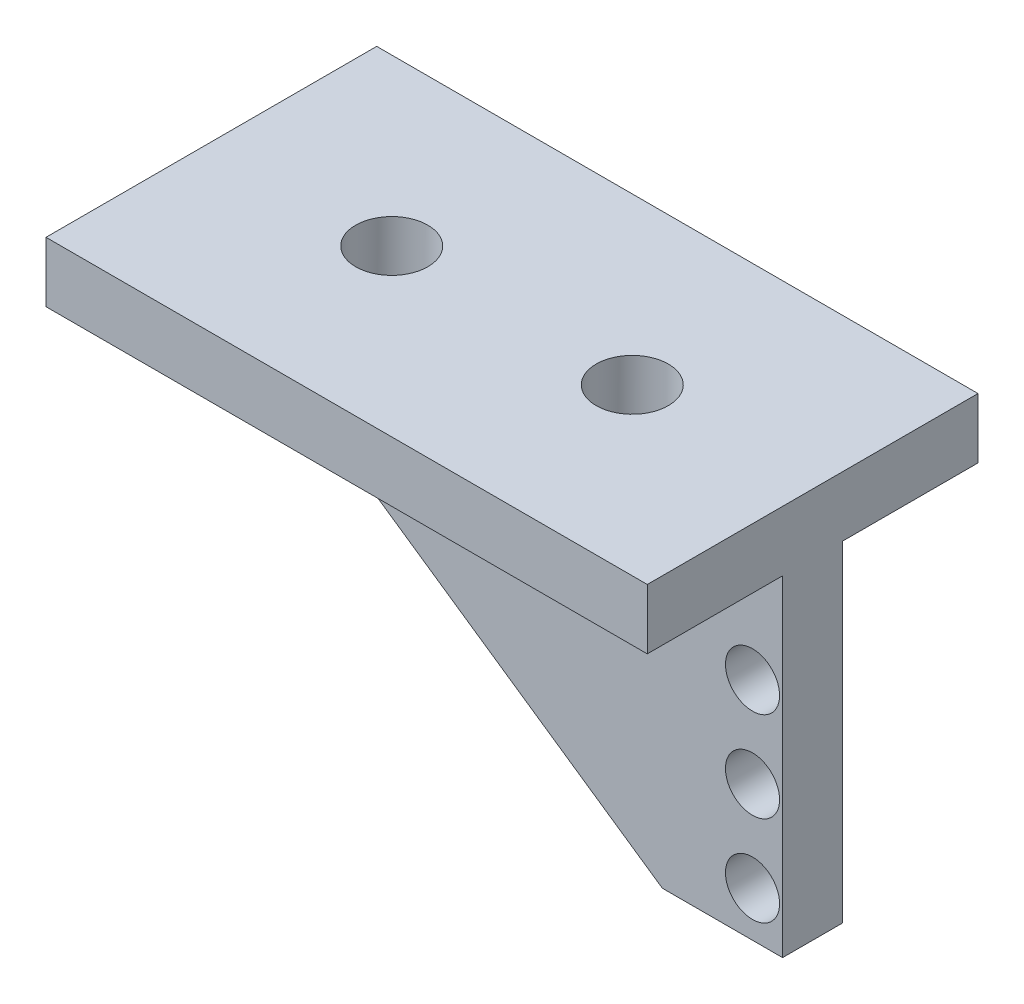
ISO-10303-21;
HEADER;
FILE_DESCRIPTION(('STEP AP214'),'2;1');
FILE_NAME('part.step','',(''),(''),'','','');
FILE_SCHEMA(('AUTOMOTIVE_DESIGN { 1 0 10303 214 1 1 1 1 }'));
ENDSEC;
DATA;
#1=APPLICATION_CONTEXT('core data for automotive mechanical design processes');
#2=APPLICATION_PROTOCOL_DEFINITION('international standard','automotive_design',2000,#1);
#3=PRODUCT_CONTEXT('',#1,'mechanical');
#4=PRODUCT('Part','Part','',(#3));
#5=PRODUCT_RELATED_PRODUCT_CATEGORY('part','',(#4));
#6=PRODUCT_DEFINITION_FORMATION('','',#4);
#7=PRODUCT_DEFINITION_CONTEXT('part definition',#1,'design');
#8=PRODUCT_DEFINITION('design','',#6,#7);
#9=PRODUCT_DEFINITION_SHAPE('','',#8);
#10=(LENGTH_UNIT() NAMED_UNIT(*) SI_UNIT(.MILLI.,.METRE.));
#11=(NAMED_UNIT(*) PLANE_ANGLE_UNIT() SI_UNIT($,.RADIAN.));
#12=(NAMED_UNIT(*) SI_UNIT($,.STERADIAN.) SOLID_ANGLE_UNIT());
#13=UNCERTAINTY_MEASURE_WITH_UNIT(LENGTH_MEASURE(1.E-05),#10,'distance_accuracy_value','');
#14=(GEOMETRIC_REPRESENTATION_CONTEXT(3) GLOBAL_UNCERTAINTY_ASSIGNED_CONTEXT((#13)) GLOBAL_UNIT_ASSIGNED_CONTEXT((#10,
#11,#12)) REPRESENTATION_CONTEXT('',''));
#15=CARTESIAN_POINT('',(0.,0.,0.));
#16=DIRECTION('',(0.,0.,1.));
#17=DIRECTION('',(1.,0.,0.));
#18=AXIS2_PLACEMENT_3D('',#15,#16,#17);
#19=CARTESIAN_POINT('',(0.,-2.,0.));
#20=DIRECTION('',(0.,-1.,0.));
#21=DIRECTION('',(0.,0.,-1.));
#22=AXIS2_PLACEMENT_3D('',#19,#20,#21);
#23=PLANE('',#22);
#24=CARTESIAN_POINT('',(-6.,-2.,0.));
#25=DIRECTION('',(0.,1.,0.));
#26=DIRECTION('',(0.,0.,1.));
#27=AXIS2_PLACEMENT_3D('',#24,#25,#26);
#28=CIRCLE('',#27,1.2);
#29=CARTESIAN_POINT('',(-6.66332495807108,-2.,1.));
#30=VERTEX_POINT('',#29);
#31=CARTESIAN_POINT('',(-5.33667504192892,-2.,1.));
#32=VERTEX_POINT('',#31);
#33=EDGE_CURVE('E271',#30,#32,#28,.T.);
#34=ORIENTED_EDGE('',*,*,#33,.T.);
#35=DIRECTION('',(1.,0.,0.));
#36=VECTOR('',#35,1.);
#37=CARTESIAN_POINT('',(0.,-2.,1.));
#38=LINE('',#37,#36);
#39=CARTESIAN_POINT('',(0.,-2.,1.));
#40=VERTEX_POINT('',#39);
#41=EDGE_CURVE('E157',#32,#40,#38,.T.);
#42=ORIENTED_EDGE('',*,*,#41,.T.);
#43=DIRECTION('',(0.,0.,-1.));
#44=VECTOR('',#43,1.);
#45=CARTESIAN_POINT('',(0.,-2.,-5.5));
#46=LINE('',#45,#44);
#47=CARTESIAN_POINT('',(0.,-2.,5.5));
#48=VERTEX_POINT('',#47);
#49=EDGE_CURVE('E172',#48,#40,#46,.T.);
#50=ORIENTED_EDGE('',*,*,#49,.F.);
#51=DIRECTION('',(1.,0.,0.));
#52=VECTOR('',#51,1.);
#53=CARTESIAN_POINT('',(0.,-2.,5.5));
#54=LINE('',#53,#52);
#55=CARTESIAN_POINT('',(-20.,-2.,5.5));
#56=VERTEX_POINT('',#55);
#57=EDGE_CURVE('E167',#56,#48,#54,.T.);
#58=ORIENTED_EDGE('',*,*,#57,.F.);
#59=DIRECTION('',(0.,0.,1.));
#60=VECTOR('',#59,1.);
#61=CARTESIAN_POINT('',(-20.,-2.,5.5));
#62=LINE('',#61,#60);
#63=CARTESIAN_POINT('',(-20.,-2.,1.));
#64=VERTEX_POINT('',#63);
#65=EDGE_CURVE('E168',#64,#56,#62,.T.);
#66=ORIENTED_EDGE('',*,*,#65,.F.);
#67=CARTESIAN_POINT('',(-14.6633249580711,-2.,1.));
#68=VERTEX_POINT('',#67);
#69=EDGE_CURVE('E153',#64,#68,#38,.T.);
#70=ORIENTED_EDGE('',*,*,#69,.T.);
#71=CARTESIAN_POINT('',(-14.,-2.,0.));
#72=DIRECTION('',(0.,1.,0.));
#73=DIRECTION('',(0.,0.,1.));
#74=AXIS2_PLACEMENT_3D('',#71,#72,#73);
#75=CIRCLE('',#74,1.2);
#76=CARTESIAN_POINT('',(-13.3366750419289,-2.,1.));
#77=VERTEX_POINT('',#76);
#78=EDGE_CURVE('E143',#68,#77,#75,.T.);
#79=ORIENTED_EDGE('',*,*,#78,.T.);
#80=EDGE_CURVE('E152',#77,#30,#38,.T.);
#81=ORIENTED_EDGE('',*,*,#80,.T.);
#82=EDGE_LOOP('',(#34,#42,#50,#58,#66,#70,#79,#81));
#83=FACE_BOUND('',#82,.T.);
#84=ADVANCED_FACE('F39',(#83),#23,.T.);
#85=CARTESIAN_POINT('',(-20.,-2.,5.5));
#86=DIRECTION('',(-1.,0.,0.));
#87=DIRECTION('',(0.,0.,1.));
#88=AXIS2_PLACEMENT_3D('',#85,#86,#87);
#89=PLANE('',#88);
#90=CARTESIAN_POINT('',(-20.,-2.,-5.5));
#91=VERTEX_POINT('',#90);
#92=CARTESIAN_POINT('',(-20.,-2.,-1.));
#93=VERTEX_POINT('',#92);
#94=EDGE_CURVE('E164',#91,#93,#62,.T.);
#95=ORIENTED_EDGE('',*,*,#94,.T.);
#96=DIRECTION('',(0.,0.,-1.));
#97=VECTOR('',#96,1.);
#98=CARTESIAN_POINT('',(-20.,-2.,1.));
#99=LINE('',#98,#97);
#100=EDGE_CURVE('E220',#64,#93,#99,.T.);
#101=ORIENTED_EDGE('',*,*,#100,.F.);
#102=ORIENTED_EDGE('',*,*,#65,.T.);
#103=DIRECTION('',(0.,1.,0.));
#104=VECTOR('',#103,1.);
#105=CARTESIAN_POINT('',(-20.,-2.,5.5));
#106=LINE('',#105,#104);
#107=CARTESIAN_POINT('',(-20.,0.,5.5));
#108=VERTEX_POINT('',#107);
#109=EDGE_CURVE('E43',#56,#108,#106,.T.);
#110=ORIENTED_EDGE('',*,*,#109,.T.);
#111=DIRECTION('',(0.,0.,1.));
#112=VECTOR('',#111,1.);
#113=CARTESIAN_POINT('',(-20.,0.,5.5));
#114=LINE('',#113,#112);
#115=CARTESIAN_POINT('',(-20.,0.,-5.5));
#116=VERTEX_POINT('',#115);
#117=EDGE_CURVE('E159',#116,#108,#114,.T.);
#118=ORIENTED_EDGE('',*,*,#117,.F.);
#119=DIRECTION('',(0.,1.,0.));
#120=VECTOR('',#119,1.);
#121=CARTESIAN_POINT('',(-20.,-2.,-5.5));
#122=LINE('',#121,#120);
#123=EDGE_CURVE('E11',#91,#116,#122,.T.);
#124=ORIENTED_EDGE('',*,*,#123,.F.);
#125=EDGE_LOOP('',(#95,#101,#102,#110,#118,#124));
#126=FACE_BOUND('',#125,.T.);
#127=ADVANCED_FACE('F41',(#126),#89,.T.);
#128=CARTESIAN_POINT('',(-20.,-2.,-5.5));
#129=DIRECTION('',(0.,0.,-1.));
#130=DIRECTION('',(-1.,0.,0.));
#131=AXIS2_PLACEMENT_3D('',#128,#129,#130);
#132=PLANE('',#131);
#133=DIRECTION('',(-1.,0.,0.));
#134=VECTOR('',#133,1.);
#135=CARTESIAN_POINT('',(-20.,0.,-5.5));
#136=LINE('',#135,#134);
#137=CARTESIAN_POINT('',(0.,0.,-5.5));
#138=VERTEX_POINT('',#137);
#139=EDGE_CURVE('E184',#138,#116,#136,.T.);
#140=ORIENTED_EDGE('',*,*,#139,.F.);
#141=DIRECTION('',(0.,1.,0.));
#142=VECTOR('',#141,1.);
#143=CARTESIAN_POINT('',(0.,-2.,-5.5));
#144=LINE('',#143,#142);
#145=CARTESIAN_POINT('',(0.,-2.,-5.5));
#146=VERTEX_POINT('',#145);
#147=EDGE_CURVE('E48',#146,#138,#144,.T.);
#148=ORIENTED_EDGE('',*,*,#147,.F.);
#149=DIRECTION('',(-1.,0.,0.));
#150=VECTOR('',#149,1.);
#151=CARTESIAN_POINT('',(-20.,-2.,-5.5));
#152=LINE('',#151,#150);
#153=EDGE_CURVE('E175',#146,#91,#152,.T.);
#154=ORIENTED_EDGE('',*,*,#153,.T.);
#155=ORIENTED_EDGE('',*,*,#123,.T.);
#156=EDGE_LOOP('',(#140,#148,#154,#155));
#157=FACE_BOUND('',#156,.T.);
#158=ADVANCED_FACE('F204',(#157),#132,.T.);
#159=CARTESIAN_POINT('',(0.,-2.,-5.5));
#160=DIRECTION('',(1.,0.,0.));
#161=DIRECTION('',(0.,0.,-1.));
#162=AXIS2_PLACEMENT_3D('',#159,#160,#161);
#163=PLANE('',#162);
#164=ORIENTED_EDGE('',*,*,#147,.T.);
#165=DIRECTION('',(0.,0.,-1.));
#166=VECTOR('',#165,1.);
#167=CARTESIAN_POINT('',(0.,0.,-5.5));
#168=LINE('',#167,#166);
#169=CARTESIAN_POINT('',(0.,0.,5.5));
#170=VERTEX_POINT('',#169);
#171=EDGE_CURVE('E182',#170,#138,#168,.T.);
#172=ORIENTED_EDGE('',*,*,#171,.F.);
#173=DIRECTION('',(0.,1.,0.));
#174=VECTOR('',#173,1.);
#175=CARTESIAN_POINT('',(0.,-2.,5.5));
#176=LINE('',#175,#174);
#177=EDGE_CURVE('E188',#48,#170,#176,.T.);
#178=ORIENTED_EDGE('',*,*,#177,.F.);
#179=ORIENTED_EDGE('',*,*,#49,.T.);
#180=DIRECTION('',(0.,1.,0.));
#181=VECTOR('',#180,1.);
#182=CARTESIAN_POINT('',(0.,0.,1.));
#183=LINE('',#182,#181);
#184=CARTESIAN_POINT('',(0.,-13.,1.));
#185=VERTEX_POINT('',#184);
#186=EDGE_CURVE('E233',#185,#40,#183,.T.);
#187=ORIENTED_EDGE('',*,*,#186,.F.);
#188=DIRECTION('',(0.,0.,-1.));
#189=VECTOR('',#188,1.);
#190=CARTESIAN_POINT('',(0.,-13.,1.));
#191=LINE('',#190,#189);
#192=CARTESIAN_POINT('',(0.,-13.,-1.));
#193=VERTEX_POINT('',#192);
#194=EDGE_CURVE('E228',#185,#193,#191,.T.);
#195=ORIENTED_EDGE('',*,*,#194,.T.);
#196=DIRECTION('',(0.,1.,0.));
#197=VECTOR('',#196,1.);
#198=CARTESIAN_POINT('',(0.,0.,-1.));
#199=LINE('',#198,#197);
#200=CARTESIAN_POINT('',(0.,-2.,-1.));
#201=VERTEX_POINT('',#200);
#202=EDGE_CURVE('E234',#193,#201,#199,.T.);
#203=ORIENTED_EDGE('',*,*,#202,.T.);
#204=EDGE_CURVE('E171',#201,#146,#46,.T.);
#205=ORIENTED_EDGE('',*,*,#204,.T.);
#206=EDGE_LOOP('',(#164,#172,#178,#179,#187,#195,#203,#205));
#207=FACE_BOUND('',#206,.T.);
#208=ADVANCED_FACE('F281',(#207),#163,.T.);
#209=CARTESIAN_POINT('',(0.,-2.,5.5));
#210=DIRECTION('',(0.,0.,1.));
#211=DIRECTION('',(1.,0.,0.));
#212=AXIS2_PLACEMENT_3D('',#209,#210,#211);
#213=PLANE('',#212);
#214=DIRECTION('',(1.,0.,0.));
#215=VECTOR('',#214,1.);
#216=CARTESIAN_POINT('',(0.,0.,5.5));
#217=LINE('',#216,#215);
#218=EDGE_CURVE('E179',#108,#170,#217,.T.);
#219=ORIENTED_EDGE('',*,*,#218,.F.);
#220=ORIENTED_EDGE('',*,*,#109,.F.);
#221=ORIENTED_EDGE('',*,*,#57,.T.);
#222=ORIENTED_EDGE('',*,*,#177,.T.);
#223=EDGE_LOOP('',(#219,#220,#221,#222));
#224=FACE_BOUND('',#223,.T.);
#225=ADVANCED_FACE('F198',(#224),#213,.T.);
#226=CARTESIAN_POINT('',(-5.33667504192892,-2.,-1.));
#227=VERTEX_POINT('',#226);
#228=CARTESIAN_POINT('',(-6.66332495807108,-2.,-1.));
#229=VERTEX_POINT('',#228);
#230=EDGE_CURVE('E272',#227,#229,#28,.T.);
#231=ORIENTED_EDGE('',*,*,#230,.T.);
#232=DIRECTION('',(1.,0.,0.));
#233=VECTOR('',#232,1.);
#234=CARTESIAN_POINT('',(0.,-2.,-1.));
#235=LINE('',#234,#233);
#236=CARTESIAN_POINT('',(-13.3366750419289,-2.,-1.));
#237=VERTEX_POINT('',#236);
#238=EDGE_CURVE('E218',#237,#229,#235,.T.);
#239=ORIENTED_EDGE('',*,*,#238,.F.);
#240=CARTESIAN_POINT('',(-14.6633249580711,-2.,-1.));
#241=VERTEX_POINT('',#240);
#242=EDGE_CURVE('E145',#237,#241,#75,.T.);
#243=ORIENTED_EDGE('',*,*,#242,.T.);
#244=EDGE_CURVE('E160',#93,#241,#235,.T.);
#245=ORIENTED_EDGE('',*,*,#244,.F.);
#246=ORIENTED_EDGE('',*,*,#94,.F.);
#247=ORIENTED_EDGE('',*,*,#153,.F.);
#248=ORIENTED_EDGE('',*,*,#204,.F.);
#249=EDGE_CURVE('E217',#227,#201,#235,.T.);
#250=ORIENTED_EDGE('',*,*,#249,.F.);
#251=EDGE_LOOP('',(#231,#239,#243,#245,#246,#247,#248,#250));
#252=FACE_BOUND('',#251,.T.);
#253=ADVANCED_FACE('F210',(#252),#23,.T.);
#254=CARTESIAN_POINT('',(0.,0.,0.));
#255=DIRECTION('',(0.,-1.,0.));
#256=DIRECTION('',(0.,0.,-1.));
#257=AXIS2_PLACEMENT_3D('',#254,#255,#256);
#258=PLANE('',#257);
#259=CARTESIAN_POINT('',(-6.,0.,0.));
#260=DIRECTION('',(0.,1.,0.));
#261=DIRECTION('',(0.,0.,1.));
#262=AXIS2_PLACEMENT_3D('',#259,#260,#261);
#263=CIRCLE('',#262,1.2);
#264=CARTESIAN_POINT('',(-6.,0.,1.2));
#265=VERTEX_POINT('',#264);
#266=EDGE_CURVE('E268',#265,#265,#263,.T.);
#267=ORIENTED_EDGE('',*,*,#266,.F.);
#268=EDGE_LOOP('',(#267));
#269=FACE_BOUND('',#268,.T.);
#270=CARTESIAN_POINT('',(-14.,0.,0.));
#271=DIRECTION('',(0.,1.,0.));
#272=DIRECTION('',(0.,0.,1.));
#273=AXIS2_PLACEMENT_3D('',#270,#271,#272);
#274=CIRCLE('',#273,1.2);
#275=CARTESIAN_POINT('',(-14.,0.,1.2));
#276=VERTEX_POINT('',#275);
#277=EDGE_CURVE('E147',#276,#276,#274,.T.);
#278=ORIENTED_EDGE('',*,*,#277,.F.);
#279=EDGE_LOOP('',(#278));
#280=FACE_BOUND('',#279,.T.);
#281=ORIENTED_EDGE('',*,*,#117,.T.);
#282=ORIENTED_EDGE('',*,*,#218,.T.);
#283=ORIENTED_EDGE('',*,*,#171,.T.);
#284=ORIENTED_EDGE('',*,*,#139,.T.);
#285=EDGE_LOOP('',(#281,#282,#283,#284));
#286=FACE_BOUND('',#285,.T.);
#287=ADVANCED_FACE('F200',(#269,#280,#286),#258,.F.);
#288=CARTESIAN_POINT('',(-4.,-13.,1.));
#289=DIRECTION('',(0.566528822887065,0.824041924199368,0.));
#290=DIRECTION('',(-0.824041924199368,0.566528822887065,0.));
#291=AXIS2_PLACEMENT_3D('',#288,#289,#290);
#292=PLANE('',#291);
#293=DIRECTION('',(0.824041924199368,-0.566528822887065,0.));
#294=VECTOR('',#293,1.);
#295=CARTESIAN_POINT('',(-4.,-13.,-1.));
#296=LINE('',#295,#294);
#297=CARTESIAN_POINT('',(-4.,-13.,-1.));
#298=VERTEX_POINT('',#297);
#299=EDGE_CURVE('E240',#93,#298,#296,.T.);
#300=ORIENTED_EDGE('',*,*,#299,.T.);
#301=DIRECTION('',(0.,0.,-1.));
#302=VECTOR('',#301,1.);
#303=CARTESIAN_POINT('',(-4.,-13.,1.));
#304=LINE('',#303,#302);
#305=CARTESIAN_POINT('',(-4.,-13.,1.));
#306=VERTEX_POINT('',#305);
#307=EDGE_CURVE('E224',#306,#298,#304,.T.);
#308=ORIENTED_EDGE('',*,*,#307,.F.);
#309=DIRECTION('',(0.824041924199368,-0.566528822887065,0.));
#310=VECTOR('',#309,1.);
#311=CARTESIAN_POINT('',(-4.,-13.,1.));
#312=LINE('',#311,#310);
#313=EDGE_CURVE('E237',#64,#306,#312,.T.);
#314=ORIENTED_EDGE('',*,*,#313,.F.);
#315=ORIENTED_EDGE('',*,*,#100,.T.);
#316=EDGE_LOOP('',(#300,#308,#314,#315));
#317=FACE_BOUND('',#316,.T.);
#318=ADVANCED_FACE('F283',(#317),#292,.F.);
#319=CARTESIAN_POINT('',(0.,-13.,1.));
#320=DIRECTION('',(0.,1.,0.));
#321=DIRECTION('',(0.,0.,1.));
#322=AXIS2_PLACEMENT_3D('',#319,#320,#321);
#323=PLANE('',#322);
#324=DIRECTION('',(1.,0.,0.));
#325=VECTOR('',#324,1.);
#326=CARTESIAN_POINT('',(0.,-13.,-1.));
#327=LINE('',#326,#325);
#328=EDGE_CURVE('E238',#298,#193,#327,.T.);
#329=ORIENTED_EDGE('',*,*,#328,.T.);
#330=ORIENTED_EDGE('',*,*,#194,.F.);
#331=DIRECTION('',(1.,0.,0.));
#332=VECTOR('',#331,1.);
#333=CARTESIAN_POINT('',(0.,-13.,1.));
#334=LINE('',#333,#332);
#335=EDGE_CURVE('E245',#306,#185,#334,.T.);
#336=ORIENTED_EDGE('',*,*,#335,.F.);
#337=ORIENTED_EDGE('',*,*,#307,.T.);
#338=EDGE_LOOP('',(#329,#330,#336,#337));
#339=FACE_BOUND('',#338,.T.);
#340=ADVANCED_FACE('F286',(#339),#323,.F.);
#341=CARTESIAN_POINT('',(0.,0.,1.));
#342=DIRECTION('',(0.,0.,-1.));
#343=DIRECTION('',(-1.,0.,0.));
#344=AXIS2_PLACEMENT_3D('',#341,#342,#343);
#345=PLANE('',#344);
#346=CARTESIAN_POINT('',(-1.,-5.5,1.));
#347=DIRECTION('',(0.,0.,1.));
#348=DIRECTION('',(1.,0.,0.));
#349=AXIS2_PLACEMENT_3D('',#346,#347,#348);
#350=CIRCLE('',#349,0.9);
#351=CARTESIAN_POINT('',(-0.1,-5.5,1.));
#352=VERTEX_POINT('',#351);
#353=EDGE_CURVE('E242',#352,#352,#350,.T.);
#354=ORIENTED_EDGE('',*,*,#353,.F.);
#355=EDGE_LOOP('',(#354));
#356=FACE_BOUND('',#355,.T.);
#357=CARTESIAN_POINT('',(-1.,-8.5,1.));
#358=DIRECTION('',(0.,0.,1.));
#359=DIRECTION('',(1.,0.,0.));
#360=AXIS2_PLACEMENT_3D('',#357,#358,#359);
#361=CIRCLE('',#360,0.9);
#362=CARTESIAN_POINT('',(-0.1,-8.5,1.));
#363=VERTEX_POINT('',#362);
#364=EDGE_CURVE('E254',#363,#363,#361,.T.);
#365=ORIENTED_EDGE('',*,*,#364,.F.);
#366=EDGE_LOOP('',(#365));
#367=FACE_BOUND('',#366,.T.);
#368=CARTESIAN_POINT('',(-1.,-11.5,1.));
#369=DIRECTION('',(0.,0.,1.));
#370=DIRECTION('',(1.,0.,0.));
#371=AXIS2_PLACEMENT_3D('',#368,#369,#370);
#372=CIRCLE('',#371,0.9);
#373=CARTESIAN_POINT('',(-0.1,-11.5,1.));
#374=VERTEX_POINT('',#373);
#375=EDGE_CURVE('E248',#374,#374,#372,.T.);
#376=ORIENTED_EDGE('',*,*,#375,.F.);
#377=EDGE_LOOP('',(#376));
#378=FACE_BOUND('',#377,.T.);
#379=ORIENTED_EDGE('',*,*,#69,.F.);
#380=ORIENTED_EDGE('',*,*,#313,.T.);
#381=ORIENTED_EDGE('',*,*,#335,.T.);
#382=ORIENTED_EDGE('',*,*,#186,.T.);
#383=ORIENTED_EDGE('',*,*,#41,.F.);
#384=DIRECTION('',(1.,0.,0.));
#385=VECTOR('',#384,1.);
#386=CARTESIAN_POINT('',(0.,-2.,1.));
#387=LINE('',#386,#385);
#388=EDGE_CURVE('E136',#30,#32,#387,.T.);
#389=ORIENTED_EDGE('',*,*,#388,.F.);
#390=ORIENTED_EDGE('',*,*,#80,.F.);
#391=DIRECTION('',(1.,0.,0.));
#392=VECTOR('',#391,1.);
#393=CARTESIAN_POINT('',(0.,-2.,1.));
#394=LINE('',#393,#392);
#395=EDGE_CURVE('E127',#68,#77,#394,.T.);
#396=ORIENTED_EDGE('',*,*,#395,.F.);
#397=EDGE_LOOP('',(#379,#380,#381,#382,#383,#389,#390,#396));
#398=FACE_BOUND('',#397,.T.);
#399=ADVANCED_FACE('F155',(#356,#367,#378,#398),#345,.F.);
#400=CARTESIAN_POINT('',(0.,0.,-1.));
#401=DIRECTION('',(0.,0.,-1.));
#402=DIRECTION('',(-1.,0.,0.));
#403=AXIS2_PLACEMENT_3D('',#400,#401,#402);
#404=PLANE('',#403);
#405=CARTESIAN_POINT('',(-1.,-5.5,-1.));
#406=DIRECTION('',(0.,0.,1.));
#407=DIRECTION('',(1.,0.,0.));
#408=AXIS2_PLACEMENT_3D('',#405,#406,#407);
#409=CIRCLE('',#408,0.9);
#410=CARTESIAN_POINT('',(-0.1,-5.5,-1.));
#411=VERTEX_POINT('',#410);
#412=EDGE_CURVE('E260',#411,#411,#409,.T.);
#413=ORIENTED_EDGE('',*,*,#412,.T.);
#414=EDGE_LOOP('',(#413));
#415=FACE_BOUND('',#414,.T.);
#416=CARTESIAN_POINT('',(-1.,-8.5,-1.));
#417=DIRECTION('',(0.,0.,1.));
#418=DIRECTION('',(1.,0.,0.));
#419=AXIS2_PLACEMENT_3D('',#416,#417,#418);
#420=CIRCLE('',#419,0.9);
#421=CARTESIAN_POINT('',(-0.1,-8.5,-1.));
#422=VERTEX_POINT('',#421);
#423=EDGE_CURVE('E257',#422,#422,#420,.T.);
#424=ORIENTED_EDGE('',*,*,#423,.T.);
#425=EDGE_LOOP('',(#424));
#426=FACE_BOUND('',#425,.T.);
#427=CARTESIAN_POINT('',(-1.,-11.5,-1.));
#428=DIRECTION('',(0.,0.,1.));
#429=DIRECTION('',(1.,0.,0.));
#430=AXIS2_PLACEMENT_3D('',#427,#428,#429);
#431=CIRCLE('',#430,0.9);
#432=CARTESIAN_POINT('',(-0.1,-11.5,-1.));
#433=VERTEX_POINT('',#432);
#434=EDGE_CURVE('E251',#433,#433,#431,.T.);
#435=ORIENTED_EDGE('',*,*,#434,.T.);
#436=EDGE_LOOP('',(#435));
#437=FACE_BOUND('',#436,.T.);
#438=ORIENTED_EDGE('',*,*,#299,.F.);
#439=ORIENTED_EDGE('',*,*,#244,.T.);
#440=EDGE_CURVE('E216',#241,#237,#235,.T.);
#441=ORIENTED_EDGE('',*,*,#440,.T.);
#442=ORIENTED_EDGE('',*,*,#238,.T.);
#443=EDGE_CURVE('E219',#229,#227,#235,.T.);
#444=ORIENTED_EDGE('',*,*,#443,.T.);
#445=ORIENTED_EDGE('',*,*,#249,.T.);
#446=ORIENTED_EDGE('',*,*,#202,.F.);
#447=ORIENTED_EDGE('',*,*,#328,.F.);
#448=EDGE_LOOP('',(#438,#439,#441,#442,#444,#445,#446,#447));
#449=FACE_BOUND('',#448,.T.);
#450=ADVANCED_FACE('F287',(#415,#426,#437,#449),#404,.T.);
#451=CARTESIAN_POINT('',(-1.,-11.5,1.));
#452=DIRECTION('',(0.,0.,-1.));
#453=DIRECTION('',(-1.,0.,0.));
#454=AXIS2_PLACEMENT_3D('',#451,#452,#453);
#455=CYLINDRICAL_SURFACE('',#454,0.9);
#456=ORIENTED_EDGE('',*,*,#375,.T.);
#457=EDGE_LOOP('',(#456));
#458=FACE_BOUND('',#457,.T.);
#459=ORIENTED_EDGE('',*,*,#434,.F.);
#460=EDGE_LOOP('',(#459));
#461=FACE_BOUND('',#460,.T.);
#462=ADVANCED_FACE('F388',(#458,#461),#455,.F.);
#463=CARTESIAN_POINT('',(-1.,-8.5,1.));
#464=DIRECTION('',(0.,0.,-1.));
#465=DIRECTION('',(-1.,0.,0.));
#466=AXIS2_PLACEMENT_3D('',#463,#464,#465);
#467=CYLINDRICAL_SURFACE('',#466,0.9);
#468=ORIENTED_EDGE('',*,*,#364,.T.);
#469=EDGE_LOOP('',(#468));
#470=FACE_BOUND('',#469,.T.);
#471=ORIENTED_EDGE('',*,*,#423,.F.);
#472=EDGE_LOOP('',(#471));
#473=FACE_BOUND('',#472,.T.);
#474=ADVANCED_FACE('F397',(#470,#473),#467,.F.);
#475=CARTESIAN_POINT('',(-1.,-5.5,1.));
#476=DIRECTION('',(0.,0.,-1.));
#477=DIRECTION('',(-1.,0.,0.));
#478=AXIS2_PLACEMENT_3D('',#475,#476,#477);
#479=CYLINDRICAL_SURFACE('',#478,0.9);
#480=ORIENTED_EDGE('',*,*,#353,.T.);
#481=EDGE_LOOP('',(#480));
#482=FACE_BOUND('',#481,.T.);
#483=ORIENTED_EDGE('',*,*,#412,.F.);
#484=EDGE_LOOP('',(#483));
#485=FACE_BOUND('',#484,.T.);
#486=ADVANCED_FACE('F307',(#482,#485),#479,.F.);
#487=CARTESIAN_POINT('',(-14.,-2.,0.));
#488=DIRECTION('',(0.,1.,0.));
#489=DIRECTION('',(0.,0.,1.));
#490=AXIS2_PLACEMENT_3D('',#487,#488,#489);
#491=PLANE('',#490);
#492=ORIENTED_EDGE('',*,*,#395,.T.);
#493=EDGE_CURVE('E130',#77,#237,#75,.T.);
#494=ORIENTED_EDGE('',*,*,#493,.T.);
#495=ORIENTED_EDGE('',*,*,#440,.F.);
#496=EDGE_CURVE('E64',#241,#68,#75,.T.);
#497=ORIENTED_EDGE('',*,*,#496,.T.);
#498=EDGE_LOOP('',(#492,#494,#495,#497));
#499=FACE_BOUND('',#498,.T.);
#500=ADVANCED_FACE('F129',(#499),#491,.T.);
#501=CARTESIAN_POINT('',(-14.,-2.,0.));
#502=DIRECTION('',(0.,1.,0.));
#503=DIRECTION('',(0.,0.,1.));
#504=AXIS2_PLACEMENT_3D('',#501,#502,#503);
#505=CYLINDRICAL_SURFACE('',#504,1.2);
#506=ORIENTED_EDGE('',*,*,#493,.F.);
#507=ORIENTED_EDGE('',*,*,#78,.F.);
#508=ORIENTED_EDGE('',*,*,#496,.F.);
#509=ORIENTED_EDGE('',*,*,#242,.F.);
#510=EDGE_LOOP('',(#506,#507,#508,#509));
#511=FACE_BOUND('',#510,.T.);
#512=ORIENTED_EDGE('',*,*,#277,.T.);
#513=EDGE_LOOP('',(#512));
#514=FACE_BOUND('',#513,.T.);
#515=ADVANCED_FACE('F141',(#511,#514),#505,.F.);
#516=CARTESIAN_POINT('',(-6.,-2.,0.));
#517=DIRECTION('',(0.,1.,0.));
#518=DIRECTION('',(0.,0.,1.));
#519=AXIS2_PLACEMENT_3D('',#516,#517,#518);
#520=PLANE('',#519);
#521=ORIENTED_EDGE('',*,*,#388,.T.);
#522=EDGE_CURVE('E137',#32,#227,#28,.T.);
#523=ORIENTED_EDGE('',*,*,#522,.T.);
#524=ORIENTED_EDGE('',*,*,#443,.F.);
#525=EDGE_CURVE('E56',#229,#30,#28,.T.);
#526=ORIENTED_EDGE('',*,*,#525,.T.);
#527=EDGE_LOOP('',(#521,#523,#524,#526));
#528=FACE_BOUND('',#527,.T.);
#529=ADVANCED_FACE('F289',(#528),#520,.T.);
#530=CARTESIAN_POINT('',(-6.,-2.,0.));
#531=DIRECTION('',(0.,1.,0.));
#532=DIRECTION('',(0.,0.,1.));
#533=AXIS2_PLACEMENT_3D('',#530,#531,#532);
#534=CYLINDRICAL_SURFACE('',#533,1.2);
#535=ORIENTED_EDGE('',*,*,#522,.F.);
#536=ORIENTED_EDGE('',*,*,#33,.F.);
#537=ORIENTED_EDGE('',*,*,#525,.F.);
#538=ORIENTED_EDGE('',*,*,#230,.F.);
#539=EDGE_LOOP('',(#535,#536,#537,#538));
#540=FACE_BOUND('',#539,.T.);
#541=ORIENTED_EDGE('',*,*,#266,.T.);
#542=EDGE_LOOP('',(#541));
#543=FACE_BOUND('',#542,.T.);
#544=ADVANCED_FACE('F290',(#540,#543),#534,.F.);
#545=CLOSED_SHELL('',(#84,#127,#158,#208,#225,#253,#287,#318,#340,#399,#450,#462,#474,#486,#500,
#515,#529,#544));
#546=MANIFOLD_SOLID_BREP('B2',#545);
#547=ADVANCED_BREP_SHAPE_REPRESENTATION('',(#18,#546),#14);
#548=SHAPE_DEFINITION_REPRESENTATION(#9,#547);
ENDSEC;
END-ISO-10303-21;
